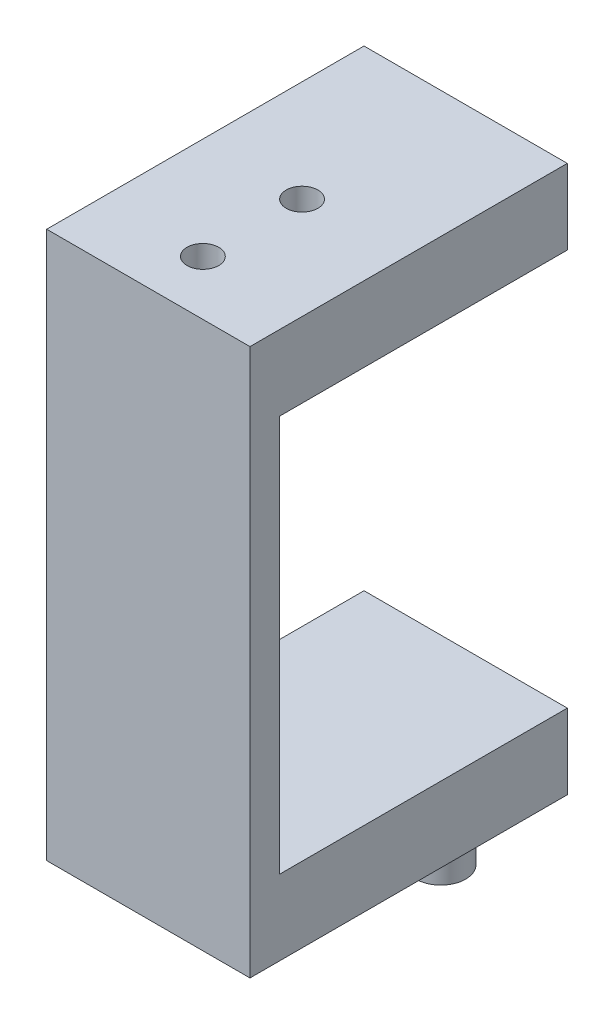
ISO-10303-21;
HEADER;
FILE_DESCRIPTION(('STEP AP214'),'2;1');
FILE_NAME('part.step','',(''),(''),'','','');
FILE_SCHEMA(('AUTOMOTIVE_DESIGN { 1 0 10303 214 1 1 1 1 }'));
ENDSEC;
DATA;
#1=APPLICATION_CONTEXT('core data for automotive mechanical design processes');
#2=APPLICATION_PROTOCOL_DEFINITION('international standard','automotive_design',2000,#1);
#3=PRODUCT_CONTEXT('',#1,'mechanical');
#4=PRODUCT('Part','Part','',(#3));
#5=PRODUCT_RELATED_PRODUCT_CATEGORY('part','',(#4));
#6=PRODUCT_DEFINITION_FORMATION('','',#4);
#7=PRODUCT_DEFINITION_CONTEXT('part definition',#1,'design');
#8=PRODUCT_DEFINITION('design','',#6,#7);
#9=PRODUCT_DEFINITION_SHAPE('','',#8);
#10=(LENGTH_UNIT() NAMED_UNIT(*) SI_UNIT(.MILLI.,.METRE.));
#11=(NAMED_UNIT(*) PLANE_ANGLE_UNIT() SI_UNIT($,.RADIAN.));
#12=(NAMED_UNIT(*) SI_UNIT($,.STERADIAN.) SOLID_ANGLE_UNIT());
#13=UNCERTAINTY_MEASURE_WITH_UNIT(LENGTH_MEASURE(1.E-05),#10,'distance_accuracy_value','');
#14=(GEOMETRIC_REPRESENTATION_CONTEXT(3) GLOBAL_UNCERTAINTY_ASSIGNED_CONTEXT((#13)) GLOBAL_UNIT_ASSIGNED_CONTEXT((#10,
#11,#12)) REPRESENTATION_CONTEXT('',''));
#15=CARTESIAN_POINT('',(0.,0.,0.));
#16=DIRECTION('',(0.,0.,1.));
#17=DIRECTION('',(1.,0.,0.));
#18=AXIS2_PLACEMENT_3D('',#15,#16,#17);
#19=CARTESIAN_POINT('',(10.25,0.,29.));
#20=DIRECTION('',(-1.,0.,0.));
#21=DIRECTION('',(0.,0.,1.));
#22=AXIS2_PLACEMENT_3D('',#19,#20,#21);
#23=PLANE('',#22);
#24=DIRECTION('',(0.,0.,-1.));
#25=VECTOR('',#24,1.);
#26=CARTESIAN_POINT('',(10.25,-27.5708524230847,32.));
#27=LINE('',#26,#25);
#28=CARTESIAN_POINT('',(10.25,-27.5708524230847,32.));
#29=VERTEX_POINT('',#28);
#30=CARTESIAN_POINT('',(10.25,-27.5708524230847,0.));
#31=VERTEX_POINT('',#30);
#32=EDGE_CURVE('E63',#29,#31,#27,.T.);
#33=ORIENTED_EDGE('',*,*,#32,.T.);
#34=DIRECTION('',(0.,1.,0.));
#35=VECTOR('',#34,1.);
#36=CARTESIAN_POINT('',(10.25,0.,0.));
#37=LINE('',#36,#35);
#38=CARTESIAN_POINT('',(10.25,-20.,0.));
#39=VERTEX_POINT('',#38);
#40=EDGE_CURVE('E121',#31,#39,#37,.T.);
#41=ORIENTED_EDGE('',*,*,#40,.T.);
#42=DIRECTION('',(0.,0.,-1.));
#43=VECTOR('',#42,1.);
#44=CARTESIAN_POINT('',(10.25,-20.,29.));
#45=LINE('',#44,#43);
#46=CARTESIAN_POINT('',(10.25,-20.,29.));
#47=VERTEX_POINT('',#46);
#48=EDGE_CURVE('E11',#47,#39,#45,.T.);
#49=ORIENTED_EDGE('',*,*,#48,.F.);
#50=DIRECTION('',(0.,1.,0.));
#51=VECTOR('',#50,1.);
#52=CARTESIAN_POINT('',(10.25,35.1417048461695,29.));
#53=LINE('',#52,#51);
#54=CARTESIAN_POINT('',(10.25,20.,29.));
#55=VERTEX_POINT('',#54);
#56=EDGE_CURVE('E199',#47,#55,#53,.T.);
#57=ORIENTED_EDGE('',*,*,#56,.T.);
#58=DIRECTION('',(0.,0.,-1.));
#59=VECTOR('',#58,1.);
#60=CARTESIAN_POINT('',(10.25,20.,29.));
#61=LINE('',#60,#59);
#62=CARTESIAN_POINT('',(10.25,20.,0.));
#63=VERTEX_POINT('',#62);
#64=EDGE_CURVE('E168',#55,#63,#61,.T.);
#65=ORIENTED_EDGE('',*,*,#64,.T.);
#66=DIRECTION('',(0.,1.,0.));
#67=VECTOR('',#66,1.);
#68=CARTESIAN_POINT('',(10.25,0.,0.));
#69=LINE('',#68,#67);
#70=CARTESIAN_POINT('',(10.25,27.5708524230847,0.));
#71=VERTEX_POINT('',#70);
#72=EDGE_CURVE('E160',#63,#71,#69,.T.);
#73=ORIENTED_EDGE('',*,*,#72,.T.);
#74=DIRECTION('',(0.,0.,-1.));
#75=VECTOR('',#74,1.);
#76=CARTESIAN_POINT('',(10.25,27.5708524230847,32.));
#77=LINE('',#76,#75);
#78=CARTESIAN_POINT('',(10.25,27.5708524230847,32.));
#79=VERTEX_POINT('',#78);
#80=EDGE_CURVE('E71',#79,#71,#77,.T.);
#81=ORIENTED_EDGE('',*,*,#80,.F.);
#82=DIRECTION('',(0.,1.,0.));
#83=VECTOR('',#82,1.);
#84=CARTESIAN_POINT('',(10.25,35.1417048461695,32.));
#85=LINE('',#84,#83);
#86=EDGE_CURVE('E198',#29,#79,#85,.T.);
#87=ORIENTED_EDGE('',*,*,#86,.F.);
#88=EDGE_LOOP('',(#33,#41,#49,#57,#65,#73,#81,#87));
#89=FACE_BOUND('',#88,.T.);
#90=ADVANCED_FACE('F47',(#89),#23,.F.);
#91=CARTESIAN_POINT('',(-10.25,0.,29.));
#92=DIRECTION('',(-1.,0.,0.));
#93=DIRECTION('',(0.,0.,1.));
#94=AXIS2_PLACEMENT_3D('',#91,#92,#93);
#95=PLANE('',#94);
#96=DIRECTION('',(0.,1.,0.));
#97=VECTOR('',#96,1.);
#98=CARTESIAN_POINT('',(-10.25,0.,0.));
#99=LINE('',#98,#97);
#100=CARTESIAN_POINT('',(-10.25,-27.5708524230847,0.));
#101=VERTEX_POINT('',#100);
#102=CARTESIAN_POINT('',(-10.25,-20.,0.));
#103=VERTEX_POINT('',#102);
#104=EDGE_CURVE('E230',#101,#103,#99,.T.);
#105=ORIENTED_EDGE('',*,*,#104,.F.);
#106=DIRECTION('',(0.,0.,-1.));
#107=VECTOR('',#106,1.);
#108=CARTESIAN_POINT('',(-10.25,-27.5708524230847,32.));
#109=LINE('',#108,#107);
#110=CARTESIAN_POINT('',(-10.25,-27.5708524230847,32.));
#111=VERTEX_POINT('',#110);
#112=EDGE_CURVE('E130',#111,#101,#109,.T.);
#113=ORIENTED_EDGE('',*,*,#112,.F.);
#114=DIRECTION('',(0.,-1.,0.));
#115=VECTOR('',#114,1.);
#116=CARTESIAN_POINT('',(-10.25,35.1417048461695,32.));
#117=LINE('',#116,#115);
#118=CARTESIAN_POINT('',(-10.25,27.5708524230847,32.));
#119=VERTEX_POINT('',#118);
#120=EDGE_CURVE('E194',#119,#111,#117,.T.);
#121=ORIENTED_EDGE('',*,*,#120,.F.);
#122=DIRECTION('',(0.,0.,-1.));
#123=VECTOR('',#122,1.);
#124=CARTESIAN_POINT('',(-10.25,27.5708524230847,32.));
#125=LINE('',#124,#123);
#126=CARTESIAN_POINT('',(-10.25,27.5708524230847,0.));
#127=VERTEX_POINT('',#126);
#128=EDGE_CURVE('E134',#119,#127,#125,.T.);
#129=ORIENTED_EDGE('',*,*,#128,.T.);
#130=DIRECTION('',(0.,1.,0.));
#131=VECTOR('',#130,1.);
#132=CARTESIAN_POINT('',(-10.25,0.,0.));
#133=LINE('',#132,#131);
#134=CARTESIAN_POINT('',(-10.25,20.,0.));
#135=VERTEX_POINT('',#134);
#136=EDGE_CURVE('E176',#135,#127,#133,.T.);
#137=ORIENTED_EDGE('',*,*,#136,.F.);
#138=DIRECTION('',(0.,0.,-1.));
#139=VECTOR('',#138,1.);
#140=CARTESIAN_POINT('',(-10.25,20.,29.));
#141=LINE('',#140,#139);
#142=CARTESIAN_POINT('',(-10.25,20.,29.));
#143=VERTEX_POINT('',#142);
#144=EDGE_CURVE('E190',#143,#135,#141,.T.);
#145=ORIENTED_EDGE('',*,*,#144,.F.);
#146=DIRECTION('',(0.,-1.,0.));
#147=VECTOR('',#146,1.);
#148=CARTESIAN_POINT('',(-10.25,35.1417048461695,29.));
#149=LINE('',#148,#147);
#150=CARTESIAN_POINT('',(-10.25,-20.,29.));
#151=VERTEX_POINT('',#150);
#152=EDGE_CURVE('E193',#143,#151,#149,.T.);
#153=ORIENTED_EDGE('',*,*,#152,.T.);
#154=DIRECTION('',(0.,0.,-1.));
#155=VECTOR('',#154,1.);
#156=CARTESIAN_POINT('',(-10.25,-20.,29.));
#157=LINE('',#156,#155);
#158=EDGE_CURVE('E56',#151,#103,#157,.T.);
#159=ORIENTED_EDGE('',*,*,#158,.T.);
#160=EDGE_LOOP('',(#105,#113,#121,#129,#137,#145,#153,#159));
#161=FACE_BOUND('',#160,.T.);
#162=ADVANCED_FACE('F240',(#161),#95,.T.);
#163=CARTESIAN_POINT('',(0.,0.,0.));
#164=DIRECTION('',(0.,0.,1.));
#165=DIRECTION('',(1.,0.,0.));
#166=AXIS2_PLACEMENT_3D('',#163,#164,#165);
#167=PLANE('',#166);
#168=CARTESIAN_POINT('',(-5.,-25.,0.));
#169=DIRECTION('',(0.,0.,1.));
#170=DIRECTION('',(1.,0.,0.));
#171=AXIS2_PLACEMENT_3D('',#168,#169,#170);
#172=CIRCLE('',#171,2.);
#173=CARTESIAN_POINT('',(-7.,-25.,0.));
#174=VERTEX_POINT('',#173);
#175=EDGE_CURVE('E214',#174,#174,#172,.F.);
#176=ORIENTED_EDGE('',*,*,#175,.F.);
#177=EDGE_LOOP('',(#176));
#178=FACE_BOUND('',#177,.T.);
#179=CARTESIAN_POINT('',(5.,-25.,0.));
#180=DIRECTION('',(0.,0.,1.));
#181=DIRECTION('',(1.,0.,0.));
#182=AXIS2_PLACEMENT_3D('',#179,#180,#181);
#183=CIRCLE('',#182,2.);
#184=CARTESIAN_POINT('',(3.,-25.,0.));
#185=VERTEX_POINT('',#184);
#186=EDGE_CURVE('E203',#185,#185,#183,.F.);
#187=ORIENTED_EDGE('',*,*,#186,.F.);
#188=EDGE_LOOP('',(#187));
#189=FACE_BOUND('',#188,.T.);
#190=DIRECTION('',(-1.,0.,0.));
#191=VECTOR('',#190,1.);
#192=CARTESIAN_POINT('',(0.,-27.5708524230847,0.));
#193=LINE('',#192,#191);
#194=CARTESIAN_POINT('',(0.,-27.5708524230847,0.));
#195=VERTEX_POINT('',#194);
#196=EDGE_CURVE('E115',#31,#195,#193,.T.);
#197=ORIENTED_EDGE('',*,*,#196,.T.);
#198=EDGE_CURVE('E118',#195,#101,#193,.T.);
#199=ORIENTED_EDGE('',*,*,#198,.T.);
#200=ORIENTED_EDGE('',*,*,#104,.T.);
#201=DIRECTION('',(1.,0.,0.));
#202=VECTOR('',#201,1.);
#203=CARTESIAN_POINT('',(0.,-20.,0.));
#204=LINE('',#203,#202);
#205=EDGE_CURVE('E227',#103,#39,#204,.T.);
#206=ORIENTED_EDGE('',*,*,#205,.T.);
#207=ORIENTED_EDGE('',*,*,#40,.F.);
#208=EDGE_LOOP('',(#197,#199,#200,#206,#207));
#209=FACE_BOUND('',#208,.T.);
#210=ADVANCED_FACE('F117',(#178,#189,#209),#167,.F.);
#211=CARTESIAN_POINT('',(0.,0.,32.));
#212=DIRECTION('',(0.,0.,1.));
#213=DIRECTION('',(1.,0.,0.));
#214=AXIS2_PLACEMENT_3D('',#211,#212,#213);
#215=PLANE('',#214);
#216=ORIENTED_EDGE('',*,*,#120,.T.);
#217=DIRECTION('',(-1.,0.,0.));
#218=VECTOR('',#217,1.);
#219=CARTESIAN_POINT('',(0.,-27.5708524230847,32.));
#220=LINE('',#219,#218);
#221=EDGE_CURVE('E124',#29,#111,#220,.T.);
#222=ORIENTED_EDGE('',*,*,#221,.F.);
#223=ORIENTED_EDGE('',*,*,#86,.T.);
#224=DIRECTION('',(-1.,0.,0.));
#225=VECTOR('',#224,1.);
#226=CARTESIAN_POINT('',(0.,27.5708524230847,32.));
#227=LINE('',#226,#225);
#228=EDGE_CURVE('E144',#79,#119,#227,.T.);
#229=ORIENTED_EDGE('',*,*,#228,.T.);
#230=EDGE_LOOP('',(#216,#222,#223,#229));
#231=FACE_BOUND('',#230,.T.);
#232=ADVANCED_FACE('F249',(#231),#215,.T.);
#233=CARTESIAN_POINT('',(0.,0.,29.));
#234=DIRECTION('',(0.,0.,1.));
#235=DIRECTION('',(1.,0.,0.));
#236=AXIS2_PLACEMENT_3D('',#233,#234,#235);
#237=PLANE('',#236);
#238=DIRECTION('',(1.,0.,0.));
#239=VECTOR('',#238,1.);
#240=CARTESIAN_POINT('',(0.,20.,29.));
#241=LINE('',#240,#239);
#242=EDGE_CURVE('E164',#143,#55,#241,.T.);
#243=ORIENTED_EDGE('',*,*,#242,.T.);
#244=ORIENTED_EDGE('',*,*,#56,.F.);
#245=DIRECTION('',(1.,0.,0.));
#246=VECTOR('',#245,1.);
#247=CARTESIAN_POINT('',(0.,-20.,29.));
#248=LINE('',#247,#246);
#249=EDGE_CURVE('E213',#151,#47,#248,.T.);
#250=ORIENTED_EDGE('',*,*,#249,.F.);
#251=ORIENTED_EDGE('',*,*,#152,.F.);
#252=EDGE_LOOP('',(#243,#244,#250,#251));
#253=FACE_BOUND('',#252,.T.);
#254=ADVANCED_FACE('F260',(#253),#237,.F.);
#255=CARTESIAN_POINT('',(0.,-20.,29.));
#256=DIRECTION('',(0.,1.,0.));
#257=DIRECTION('',(0.,0.,1.));
#258=AXIS2_PLACEMENT_3D('',#255,#256,#257);
#259=PLANE('',#258);
#260=ORIENTED_EDGE('',*,*,#205,.F.);
#261=ORIENTED_EDGE('',*,*,#158,.F.);
#262=ORIENTED_EDGE('',*,*,#249,.T.);
#263=ORIENTED_EDGE('',*,*,#48,.T.);
#264=EDGE_LOOP('',(#260,#261,#262,#263));
#265=FACE_BOUND('',#264,.T.);
#266=ADVANCED_FACE('F244',(#265),#259,.T.);
#267=CARTESIAN_POINT('',(5.,-25.,29.));
#268=DIRECTION('',(0.,0.,-1.));
#269=DIRECTION('',(-1.,0.,0.));
#270=AXIS2_PLACEMENT_3D('',#267,#268,#269);
#271=CYLINDRICAL_SURFACE('',#270,2.);
#272=CARTESIAN_POINT('',(5.,-25.,29.));
#273=DIRECTION('',(0.,0.,1.));
#274=DIRECTION('',(1.,0.,0.));
#275=AXIS2_PLACEMENT_3D('',#272,#273,#274);
#276=CIRCLE('',#275,2.);
#277=CARTESIAN_POINT('',(3.,-25.,29.));
#278=VERTEX_POINT('',#277);
#279=EDGE_CURVE('E209',#278,#278,#276,.F.);
#280=CARTESIAN_POINT('',(3.,-25.,29.));
#281=CARTESIAN_POINT('',(3.,-25.,28.6979166666667));
#282=CARTESIAN_POINT('',(3.,-25.,28.3958333333333));
#283=CARTESIAN_POINT('',(3.,-25.,27.7916666666667));
#284=CARTESIAN_POINT('',(3.,-25.,27.4895833333333));
#285=CARTESIAN_POINT('',(3.,-25.,26.8854166666667));
#286=CARTESIAN_POINT('',(3.,-25.,26.5833333333333));
#287=CARTESIAN_POINT('',(3.,-25.,25.9791666666667));
#288=CARTESIAN_POINT('',(3.,-25.,25.6770833333333));
#289=CARTESIAN_POINT('',(3.,-25.,25.0729166666667));
#290=CARTESIAN_POINT('',(3.,-25.,24.7708333333333));
#291=CARTESIAN_POINT('',(3.,-25.,24.1666666666667));
#292=CARTESIAN_POINT('',(3.,-25.,23.8645833333333));
#293=CARTESIAN_POINT('',(3.,-25.,23.2604166666667));
#294=CARTESIAN_POINT('',(3.,-25.,22.9583333333333));
#295=CARTESIAN_POINT('',(3.,-25.,22.3541666666667));
#296=CARTESIAN_POINT('',(3.,-25.,22.0520833333333));
#297=CARTESIAN_POINT('',(3.,-25.,21.4479166666667));
#298=CARTESIAN_POINT('',(3.,-25.,21.1458333333333));
#299=CARTESIAN_POINT('',(3.,-25.,20.5416666666667));
#300=CARTESIAN_POINT('',(3.,-25.,20.2395833333333));
#301=CARTESIAN_POINT('',(3.,-25.,19.6354166666667));
#302=CARTESIAN_POINT('',(3.,-25.,19.3333333333333));
#303=CARTESIAN_POINT('',(3.,-25.,18.7291666666667));
#304=CARTESIAN_POINT('',(3.,-25.,18.4270833333333));
#305=CARTESIAN_POINT('',(3.,-25.,17.8229166666667));
#306=CARTESIAN_POINT('',(3.,-25.,17.5208333333333));
#307=CARTESIAN_POINT('',(3.,-25.,16.9166666666667));
#308=CARTESIAN_POINT('',(3.,-25.,16.6145833333333));
#309=CARTESIAN_POINT('',(3.,-25.,16.0104166666667));
#310=CARTESIAN_POINT('',(3.,-25.,15.7083333333333));
#311=CARTESIAN_POINT('',(3.,-25.,15.1041666666667));
#312=CARTESIAN_POINT('',(3.,-25.,14.8020833333333));
#313=CARTESIAN_POINT('',(3.,-25.,14.1979166666667));
#314=CARTESIAN_POINT('',(3.,-25.,13.8958333333333));
#315=CARTESIAN_POINT('',(3.,-25.,13.2916666666667));
#316=CARTESIAN_POINT('',(3.,-25.,12.9895833333333));
#317=CARTESIAN_POINT('',(3.,-25.,12.3854166666667));
#318=CARTESIAN_POINT('',(3.,-25.,12.0833333333333));
#319=CARTESIAN_POINT('',(3.,-25.,11.4791666666667));
#320=CARTESIAN_POINT('',(3.,-25.,11.1770833333333));
#321=CARTESIAN_POINT('',(3.,-25.,10.5729166666667));
#322=CARTESIAN_POINT('',(3.,-25.,10.2708333333333));
#323=CARTESIAN_POINT('',(3.,-25.,9.66666666666667));
#324=CARTESIAN_POINT('',(3.,-25.,9.36458333333333));
#325=CARTESIAN_POINT('',(3.,-25.,8.76041666666667));
#326=CARTESIAN_POINT('',(3.,-25.,8.45833333333333));
#327=CARTESIAN_POINT('',(3.,-25.,7.85416666666667));
#328=CARTESIAN_POINT('',(3.,-25.,7.55208333333333));
#329=CARTESIAN_POINT('',(3.,-25.,6.94791666666667));
#330=CARTESIAN_POINT('',(3.,-25.,6.64583333333333));
#331=CARTESIAN_POINT('',(3.,-25.,6.04166666666667));
#332=CARTESIAN_POINT('',(3.,-25.,5.73958333333333));
#333=CARTESIAN_POINT('',(3.,-25.,5.13541666666667));
#334=CARTESIAN_POINT('',(3.,-25.,4.83333333333333));
#335=CARTESIAN_POINT('',(3.,-25.,4.22916666666667));
#336=CARTESIAN_POINT('',(3.,-25.,3.92708333333333));
#337=CARTESIAN_POINT('',(3.,-25.,3.32291666666667));
#338=CARTESIAN_POINT('',(3.,-25.,3.02083333333333));
#339=CARTESIAN_POINT('',(3.,-25.,2.41666666666667));
#340=CARTESIAN_POINT('',(3.,-25.,2.11458333333333));
#341=CARTESIAN_POINT('',(3.,-25.,1.51041666666667));
#342=CARTESIAN_POINT('',(3.,-25.,1.20833333333333));
#343=CARTESIAN_POINT('',(3.,-25.,0.604166666666667));
#344=CARTESIAN_POINT('',(3.,-25.,0.302083333333333));
#345=CARTESIAN_POINT('',(3.,-25.,0.));
#346=B_SPLINE_CURVE_WITH_KNOTS('',3,(#280,#281,#282,#283,#284,#285,#286,#287,#288,#289,#290,
#291,#292,#293,#294,#295,#296,#297,#298,#299,#300,#301,#302,#303,#304,#305,#306,#307,#308,#309,
#310,#311,#312,#313,#314,#315,#316,#317,#318,#319,#320,#321,#322,#323,#324,#325,#326,#327,#328,
#329,#330,#331,#332,#333,#334,#335,#336,#337,#338,#339,#340,#341,#342,#343,#344,#345),
.UNSPECIFIED.,.F.,.F.,(4,2,2,2,2,2,2,2,2,2,2,2,2,2,2,2,2,2,2,2,2,2,2,2,2,2,2,2,2,2,2,2,4),(0.,
0.906249999999997,1.8125,2.71875,3.625,4.53125,5.4375,6.34375,7.25,8.15625,9.0625,9.96875,
10.875,11.78125,12.6875,13.59375,14.5,15.40625,16.3125,17.21875,18.125,19.03125,19.9375,
20.84375,21.75,22.65625,23.5625,24.46875,25.375,26.28125,27.1875,28.09375,29.),.UNSPECIFIED.);
#347=EDGE_CURVE('BSEAM49',#278,#185,#346,.T.);
#348=ORIENTED_EDGE('',*,*,#279,.F.);
#349=ORIENTED_EDGE('',*,*,#186,.T.);
#350=ORIENTED_EDGE('',*,*,#347,.T.);
#351=ORIENTED_EDGE('',*,*,#347,.F.);
#352=EDGE_LOOP('',(#348,#350,#349,#351));
#353=FACE_BOUND('',#352,.T.);
#354=ADVANCED_FACE('F49',(#353),#271,.F.);
#355=CARTESIAN_POINT('',(-5.,-25.,29.));
#356=DIRECTION('',(0.,0.,-1.));
#357=DIRECTION('',(-1.,0.,0.));
#358=AXIS2_PLACEMENT_3D('',#355,#356,#357);
#359=CYLINDRICAL_SURFACE('',#358,2.);
#360=CARTESIAN_POINT('',(-5.,-25.,29.));
#361=DIRECTION('',(0.,0.,1.));
#362=DIRECTION('',(1.,0.,0.));
#363=AXIS2_PLACEMENT_3D('',#360,#361,#362);
#364=CIRCLE('',#363,2.);
#365=CARTESIAN_POINT('',(-7.,-25.,29.));
#366=VERTEX_POINT('',#365);
#367=EDGE_CURVE('E218',#366,#366,#364,.F.);
#368=CARTESIAN_POINT('',(-7.,-25.,29.));
#369=CARTESIAN_POINT('',(-7.,-25.,28.6979166666667));
#370=CARTESIAN_POINT('',(-7.,-25.,28.3958333333333));
#371=CARTESIAN_POINT('',(-7.,-25.,27.7916666666667));
#372=CARTESIAN_POINT('',(-7.,-25.,27.4895833333333));
#373=CARTESIAN_POINT('',(-7.,-25.,26.8854166666667));
#374=CARTESIAN_POINT('',(-7.,-25.,26.5833333333333));
#375=CARTESIAN_POINT('',(-7.,-25.,25.9791666666667));
#376=CARTESIAN_POINT('',(-7.,-25.,25.6770833333333));
#377=CARTESIAN_POINT('',(-7.,-25.,25.0729166666667));
#378=CARTESIAN_POINT('',(-7.,-25.,24.7708333333333));
#379=CARTESIAN_POINT('',(-7.,-25.,24.1666666666667));
#380=CARTESIAN_POINT('',(-7.,-25.,23.8645833333333));
#381=CARTESIAN_POINT('',(-7.,-25.,23.2604166666667));
#382=CARTESIAN_POINT('',(-7.,-25.,22.9583333333333));
#383=CARTESIAN_POINT('',(-7.,-25.,22.3541666666667));
#384=CARTESIAN_POINT('',(-7.,-25.,22.0520833333333));
#385=CARTESIAN_POINT('',(-7.,-25.,21.4479166666667));
#386=CARTESIAN_POINT('',(-7.,-25.,21.1458333333333));
#387=CARTESIAN_POINT('',(-7.,-25.,20.5416666666667));
#388=CARTESIAN_POINT('',(-7.,-25.,20.2395833333333));
#389=CARTESIAN_POINT('',(-7.,-25.,19.6354166666667));
#390=CARTESIAN_POINT('',(-7.,-25.,19.3333333333333));
#391=CARTESIAN_POINT('',(-7.,-25.,18.7291666666667));
#392=CARTESIAN_POINT('',(-7.,-25.,18.4270833333333));
#393=CARTESIAN_POINT('',(-7.,-25.,17.8229166666667));
#394=CARTESIAN_POINT('',(-7.,-25.,17.5208333333333));
#395=CARTESIAN_POINT('',(-7.,-25.,16.9166666666667));
#396=CARTESIAN_POINT('',(-7.,-25.,16.6145833333333));
#397=CARTESIAN_POINT('',(-7.,-25.,16.0104166666667));
#398=CARTESIAN_POINT('',(-7.,-25.,15.7083333333333));
#399=CARTESIAN_POINT('',(-7.,-25.,15.1041666666667));
#400=CARTESIAN_POINT('',(-7.,-25.,14.8020833333333));
#401=CARTESIAN_POINT('',(-7.,-25.,14.1979166666667));
#402=CARTESIAN_POINT('',(-7.,-25.,13.8958333333333));
#403=CARTESIAN_POINT('',(-7.,-25.,13.2916666666667));
#404=CARTESIAN_POINT('',(-7.,-25.,12.9895833333333));
#405=CARTESIAN_POINT('',(-7.,-25.,12.3854166666667));
#406=CARTESIAN_POINT('',(-7.,-25.,12.0833333333333));
#407=CARTESIAN_POINT('',(-7.,-25.,11.4791666666667));
#408=CARTESIAN_POINT('',(-7.,-25.,11.1770833333333));
#409=CARTESIAN_POINT('',(-7.,-25.,10.5729166666667));
#410=CARTESIAN_POINT('',(-7.,-25.,10.2708333333333));
#411=CARTESIAN_POINT('',(-7.,-25.,9.66666666666667));
#412=CARTESIAN_POINT('',(-7.,-25.,9.36458333333333));
#413=CARTESIAN_POINT('',(-7.,-25.,8.76041666666667));
#414=CARTESIAN_POINT('',(-7.,-25.,8.45833333333333));
#415=CARTESIAN_POINT('',(-7.,-25.,7.85416666666667));
#416=CARTESIAN_POINT('',(-7.,-25.,7.55208333333333));
#417=CARTESIAN_POINT('',(-7.,-25.,6.94791666666667));
#418=CARTESIAN_POINT('',(-7.,-25.,6.64583333333333));
#419=CARTESIAN_POINT('',(-7.,-25.,6.04166666666667));
#420=CARTESIAN_POINT('',(-7.,-25.,5.73958333333333));
#421=CARTESIAN_POINT('',(-7.,-25.,5.13541666666667));
#422=CARTESIAN_POINT('',(-7.,-25.,4.83333333333333));
#423=CARTESIAN_POINT('',(-7.,-25.,4.22916666666667));
#424=CARTESIAN_POINT('',(-7.,-25.,3.92708333333333));
#425=CARTESIAN_POINT('',(-7.,-25.,3.32291666666667));
#426=CARTESIAN_POINT('',(-7.,-25.,3.02083333333333));
#427=CARTESIAN_POINT('',(-7.,-25.,2.41666666666667));
#428=CARTESIAN_POINT('',(-7.,-25.,2.11458333333333));
#429=CARTESIAN_POINT('',(-7.,-25.,1.51041666666667));
#430=CARTESIAN_POINT('',(-7.,-25.,1.20833333333333));
#431=CARTESIAN_POINT('',(-7.,-25.,0.604166666666667));
#432=CARTESIAN_POINT('',(-7.,-25.,0.302083333333333));
#433=CARTESIAN_POINT('',(-7.,-25.,0.));
#434=B_SPLINE_CURVE_WITH_KNOTS('',3,(#368,#369,#370,#371,#372,#373,#374,#375,#376,#377,#378,
#379,#380,#381,#382,#383,#384,#385,#386,#387,#388,#389,#390,#391,#392,#393,#394,#395,#396,#397,
#398,#399,#400,#401,#402,#403,#404,#405,#406,#407,#408,#409,#410,#411,#412,#413,#414,#415,#416,
#417,#418,#419,#420,#421,#422,#423,#424,#425,#426,#427,#428,#429,#430,#431,#432,#433),
.UNSPECIFIED.,.F.,.F.,(4,2,2,2,2,2,2,2,2,2,2,2,2,2,2,2,2,2,2,2,2,2,2,2,2,2,2,2,2,2,2,2,4),(0.,
0.906249999999997,1.8125,2.71875,3.625,4.53125,5.4375,6.34375,7.25,8.15625,9.0625,9.96875,
10.875,11.78125,12.6875,13.59375,14.5,15.40625,16.3125,17.21875,18.125,19.03125,19.9375,
20.84375,21.75,22.65625,23.5625,24.46875,25.375,26.28125,27.1875,28.09375,29.),.UNSPECIFIED.);
#435=EDGE_CURVE('BSEAM286',#366,#174,#434,.T.);
#436=ORIENTED_EDGE('',*,*,#367,.F.);
#437=ORIENTED_EDGE('',*,*,#175,.T.);
#438=ORIENTED_EDGE('',*,*,#435,.T.);
#439=ORIENTED_EDGE('',*,*,#435,.F.);
#440=EDGE_LOOP('',(#436,#438,#437,#439));
#441=FACE_BOUND('',#440,.T.);
#442=ADVANCED_FACE('F286',(#441),#359,.F.);
#443=ORIENTED_EDGE('',*,*,#367,.T.);
#444=EDGE_LOOP('',(#443));
#445=FACE_BOUND('',#444,.T.);
#446=ADVANCED_FACE('F279',(#445),#237,.F.);
#447=ORIENTED_EDGE('',*,*,#279,.T.);
#448=EDGE_LOOP('',(#447));
#449=FACE_BOUND('',#448,.T.);
#450=ADVANCED_FACE('F276',(#449),#237,.F.);
#451=CARTESIAN_POINT('',(0.,20.,29.));
#452=DIRECTION('',(0.,1.,0.));
#453=DIRECTION('',(0.,0.,1.));
#454=AXIS2_PLACEMENT_3D('',#451,#452,#453);
#455=PLANE('',#454);
#456=CARTESIAN_POINT('',(0.,20.,16.5));
#457=DIRECTION('',(0.,1.,0.));
#458=DIRECTION('',(0.,0.,1.));
#459=AXIS2_PLACEMENT_3D('',#456,#457,#458);
#460=CIRCLE('',#459,1.6);
#461=CARTESIAN_POINT('',(0.,20.,18.1));
#462=VERTEX_POINT('',#461);
#463=EDGE_CURVE('E475',#462,#462,#460,.F.);
#464=ORIENTED_EDGE('',*,*,#463,.F.);
#465=EDGE_LOOP('',(#464));
#466=FACE_BOUND('',#465,.T.);
#467=CARTESIAN_POINT('',(0.,20.,26.5));
#468=DIRECTION('',(0.,1.,0.));
#469=DIRECTION('',(0.,0.,1.));
#470=AXIS2_PLACEMENT_3D('',#467,#468,#469);
#471=CIRCLE('',#470,1.6);
#472=CARTESIAN_POINT('',(0.,20.,28.1));
#473=VERTEX_POINT('',#472);
#474=EDGE_CURVE('E480',#473,#473,#471,.F.);
#475=ORIENTED_EDGE('',*,*,#474,.F.);
#476=EDGE_LOOP('',(#475));
#477=FACE_BOUND('',#476,.T.);
#478=DIRECTION('',(1.,0.,0.));
#479=VECTOR('',#478,1.);
#480=CARTESIAN_POINT('',(0.,20.,0.));
#481=LINE('',#480,#479);
#482=EDGE_CURVE('E180',#135,#63,#481,.T.);
#483=ORIENTED_EDGE('',*,*,#482,.T.);
#484=ORIENTED_EDGE('',*,*,#64,.F.);
#485=ORIENTED_EDGE('',*,*,#242,.F.);
#486=ORIENTED_EDGE('',*,*,#144,.T.);
#487=EDGE_LOOP('',(#483,#484,#485,#486));
#488=FACE_BOUND('',#487,.T.);
#489=ADVANCED_FACE('F257',(#466,#477,#488),#455,.F.);
#490=CARTESIAN_POINT('',(-5.,25.,29.));
#491=DIRECTION('',(0.,0.,-1.));
#492=DIRECTION('',(-1.,0.,0.));
#493=AXIS2_PLACEMENT_3D('',#490,#491,#492);
#494=CYLINDRICAL_SURFACE('',#493,2.);
#495=CARTESIAN_POINT('',(-5.,25.,29.));
#496=DIRECTION('',(0.,0.,1.));
#497=DIRECTION('',(1.,0.,0.));
#498=AXIS2_PLACEMENT_3D('',#495,#496,#497);
#499=CIRCLE('',#498,2.);
#500=CARTESIAN_POINT('',(-7.,25.,29.));
#501=VERTEX_POINT('',#500);
#502=EDGE_CURVE('E159',#501,#501,#499,.T.);
#503=CARTESIAN_POINT('',(-5.,25.,0.));
#504=DIRECTION('',(0.,0.,1.));
#505=DIRECTION('',(1.,0.,0.));
#506=AXIS2_PLACEMENT_3D('',#503,#504,#505);
#507=CIRCLE('',#506,2.);
#508=CARTESIAN_POINT('',(-7.,25.,0.));
#509=VERTEX_POINT('',#508);
#510=EDGE_CURVE('E172',#509,#509,#507,.T.);
#511=CARTESIAN_POINT('',(-7.,25.,29.));
#512=CARTESIAN_POINT('',(-7.,25.,28.6979166666667));
#513=CARTESIAN_POINT('',(-7.,25.,28.3958333333333));
#514=CARTESIAN_POINT('',(-7.,25.,27.7916666666667));
#515=CARTESIAN_POINT('',(-7.,25.,27.4895833333333));
#516=CARTESIAN_POINT('',(-7.,25.,26.8854166666667));
#517=CARTESIAN_POINT('',(-7.,25.,26.5833333333333));
#518=CARTESIAN_POINT('',(-7.,25.,25.9791666666667));
#519=CARTESIAN_POINT('',(-7.,25.,25.6770833333333));
#520=CARTESIAN_POINT('',(-7.,25.,25.0729166666667));
#521=CARTESIAN_POINT('',(-7.,25.,24.7708333333333));
#522=CARTESIAN_POINT('',(-7.,25.,24.1666666666667));
#523=CARTESIAN_POINT('',(-7.,25.,23.8645833333333));
#524=CARTESIAN_POINT('',(-7.,25.,23.2604166666667));
#525=CARTESIAN_POINT('',(-7.,25.,22.9583333333333));
#526=CARTESIAN_POINT('',(-7.,25.,22.3541666666667));
#527=CARTESIAN_POINT('',(-7.,25.,22.0520833333333));
#528=CARTESIAN_POINT('',(-7.,25.,21.4479166666667));
#529=CARTESIAN_POINT('',(-7.,25.,21.1458333333333));
#530=CARTESIAN_POINT('',(-7.,25.,20.5416666666667));
#531=CARTESIAN_POINT('',(-7.,25.,20.2395833333333));
#532=CARTESIAN_POINT('',(-7.,25.,19.6354166666667));
#533=CARTESIAN_POINT('',(-7.,25.,19.3333333333333));
#534=CARTESIAN_POINT('',(-7.,25.,18.7291666666667));
#535=CARTESIAN_POINT('',(-7.,25.,18.4270833333333));
#536=CARTESIAN_POINT('',(-7.,25.,17.8229166666667));
#537=CARTESIAN_POINT('',(-7.,25.,17.5208333333333));
#538=CARTESIAN_POINT('',(-7.,25.,16.9166666666667));
#539=CARTESIAN_POINT('',(-7.,25.,16.6145833333333));
#540=CARTESIAN_POINT('',(-7.,25.,16.0104166666667));
#541=CARTESIAN_POINT('',(-7.,25.,15.7083333333333));
#542=CARTESIAN_POINT('',(-7.,25.,15.1041666666667));
#543=CARTESIAN_POINT('',(-7.,25.,14.8020833333333));
#544=CARTESIAN_POINT('',(-7.,25.,14.1979166666667));
#545=CARTESIAN_POINT('',(-7.,25.,13.8958333333333));
#546=CARTESIAN_POINT('',(-7.,25.,13.2916666666667));
#547=CARTESIAN_POINT('',(-7.,25.,12.9895833333333));
#548=CARTESIAN_POINT('',(-7.,25.,12.3854166666667));
#549=CARTESIAN_POINT('',(-7.,25.,12.0833333333333));
#550=CARTESIAN_POINT('',(-7.,25.,11.4791666666667));
#551=CARTESIAN_POINT('',(-7.,25.,11.1770833333333));
#552=CARTESIAN_POINT('',(-7.,25.,10.5729166666667));
#553=CARTESIAN_POINT('',(-7.,25.,10.2708333333333));
#554=CARTESIAN_POINT('',(-7.,25.,9.66666666666667));
#555=CARTESIAN_POINT('',(-7.,25.,9.36458333333333));
#556=CARTESIAN_POINT('',(-7.,25.,8.76041666666667));
#557=CARTESIAN_POINT('',(-7.,25.,8.45833333333333));
#558=CARTESIAN_POINT('',(-7.,25.,7.85416666666667));
#559=CARTESIAN_POINT('',(-7.,25.,7.55208333333333));
#560=CARTESIAN_POINT('',(-7.,25.,6.94791666666667));
#561=CARTESIAN_POINT('',(-7.,25.,6.64583333333333));
#562=CARTESIAN_POINT('',(-7.,25.,6.04166666666667));
#563=CARTESIAN_POINT('',(-7.,25.,5.73958333333333));
#564=CARTESIAN_POINT('',(-7.,25.,5.13541666666667));
#565=CARTESIAN_POINT('',(-7.,25.,4.83333333333333));
#566=CARTESIAN_POINT('',(-7.,25.,4.22916666666667));
#567=CARTESIAN_POINT('',(-7.,25.,3.92708333333333));
#568=CARTESIAN_POINT('',(-7.,25.,3.32291666666667));
#569=CARTESIAN_POINT('',(-7.,25.,3.02083333333333));
#570=CARTESIAN_POINT('',(-7.,25.,2.41666666666667));
#571=CARTESIAN_POINT('',(-7.,25.,2.11458333333333));
#572=CARTESIAN_POINT('',(-7.,25.,1.51041666666667));
#573=CARTESIAN_POINT('',(-7.,25.,1.20833333333333));
#574=CARTESIAN_POINT('',(-7.,25.,0.604166666666667));
#575=CARTESIAN_POINT('',(-7.,25.,0.302083333333333));
#576=CARTESIAN_POINT('',(-7.,25.,0.));
#577=B_SPLINE_CURVE_WITH_KNOTS('',3,(#511,#512,#513,#514,#515,#516,#517,#518,#519,#520,#521,
#522,#523,#524,#525,#526,#527,#528,#529,#530,#531,#532,#533,#534,#535,#536,#537,#538,#539,#540,
#541,#542,#543,#544,#545,#546,#547,#548,#549,#550,#551,#552,#553,#554,#555,#556,#557,#558,#559,
#560,#561,#562,#563,#564,#565,#566,#567,#568,#569,#570,#571,#572,#573,#574,#575,#576),
.UNSPECIFIED.,.F.,.F.,(4,2,2,2,2,2,2,2,2,2,2,2,2,2,2,2,2,2,2,2,2,2,2,2,2,2,2,2,2,2,2,2,4),(0.,
0.906249999999997,1.8125,2.71875,3.625,4.53125,5.4375,6.34375,7.25,8.15625,9.0625,9.96875,
10.875,11.78125,12.6875,13.59375,14.5,15.40625,16.3125,17.21875,18.125,19.03125,19.9375,
20.84375,21.75,22.65625,23.5625,24.46875,25.375,26.28125,27.1875,28.09375,29.),.UNSPECIFIED.);
#578=EDGE_CURVE('BSEAM310',#501,#509,#577,.T.);
#579=ORIENTED_EDGE('',*,*,#502,.T.);
#580=ORIENTED_EDGE('',*,*,#510,.F.);
#581=ORIENTED_EDGE('',*,*,#578,.T.);
#582=ORIENTED_EDGE('',*,*,#578,.F.);
#583=EDGE_LOOP('',(#579,#581,#580,#582));
#584=FACE_BOUND('',#583,.T.);
#585=ADVANCED_FACE('F310',(#584),#494,.F.);
#586=CARTESIAN_POINT('',(5.,25.,29.));
#587=DIRECTION('',(0.,0.,-1.));
#588=DIRECTION('',(-1.,0.,0.));
#589=AXIS2_PLACEMENT_3D('',#586,#587,#588);
#590=CYLINDRICAL_SURFACE('',#589,2.);
#591=CARTESIAN_POINT('',(5.,25.,29.));
#592=DIRECTION('',(0.,0.,1.));
#593=DIRECTION('',(1.,0.,0.));
#594=AXIS2_PLACEMENT_3D('',#591,#592,#593);
#595=CIRCLE('',#594,2.);
#596=CARTESIAN_POINT('',(3.,25.,29.));
#597=VERTEX_POINT('',#596);
#598=EDGE_CURVE('E155',#597,#597,#595,.T.);
#599=CARTESIAN_POINT('',(5.,25.,0.));
#600=DIRECTION('',(0.,0.,1.));
#601=DIRECTION('',(1.,0.,0.));
#602=AXIS2_PLACEMENT_3D('',#599,#600,#601);
#603=CIRCLE('',#602,2.);
#604=CARTESIAN_POINT('',(3.,25.,0.));
#605=VERTEX_POINT('',#604);
#606=EDGE_CURVE('E141',#605,#605,#603,.T.);
#607=CARTESIAN_POINT('',(3.,25.,29.));
#608=CARTESIAN_POINT('',(3.,25.,28.6979166666667));
#609=CARTESIAN_POINT('',(3.,25.,28.3958333333333));
#610=CARTESIAN_POINT('',(3.,25.,27.7916666666667));
#611=CARTESIAN_POINT('',(3.,25.,27.4895833333333));
#612=CARTESIAN_POINT('',(3.,25.,26.8854166666667));
#613=CARTESIAN_POINT('',(3.,25.,26.5833333333333));
#614=CARTESIAN_POINT('',(3.,25.,25.9791666666667));
#615=CARTESIAN_POINT('',(3.,25.,25.6770833333333));
#616=CARTESIAN_POINT('',(3.,25.,25.0729166666667));
#617=CARTESIAN_POINT('',(3.,25.,24.7708333333333));
#618=CARTESIAN_POINT('',(3.,25.,24.1666666666667));
#619=CARTESIAN_POINT('',(3.,25.,23.8645833333333));
#620=CARTESIAN_POINT('',(3.,25.,23.2604166666667));
#621=CARTESIAN_POINT('',(3.,25.,22.9583333333333));
#622=CARTESIAN_POINT('',(3.,25.,22.3541666666667));
#623=CARTESIAN_POINT('',(3.,25.,22.0520833333333));
#624=CARTESIAN_POINT('',(3.,25.,21.4479166666667));
#625=CARTESIAN_POINT('',(3.,25.,21.1458333333333));
#626=CARTESIAN_POINT('',(3.,25.,20.5416666666667));
#627=CARTESIAN_POINT('',(3.,25.,20.2395833333333));
#628=CARTESIAN_POINT('',(3.,25.,19.6354166666667));
#629=CARTESIAN_POINT('',(3.,25.,19.3333333333333));
#630=CARTESIAN_POINT('',(3.,25.,18.7291666666667));
#631=CARTESIAN_POINT('',(3.,25.,18.4270833333333));
#632=CARTESIAN_POINT('',(3.,25.,17.8229166666667));
#633=CARTESIAN_POINT('',(3.,25.,17.5208333333333));
#634=CARTESIAN_POINT('',(3.,25.,16.9166666666667));
#635=CARTESIAN_POINT('',(3.,25.,16.6145833333333));
#636=CARTESIAN_POINT('',(3.,25.,16.0104166666667));
#637=CARTESIAN_POINT('',(3.,25.,15.7083333333333));
#638=CARTESIAN_POINT('',(3.,25.,15.1041666666667));
#639=CARTESIAN_POINT('',(3.,25.,14.8020833333333));
#640=CARTESIAN_POINT('',(3.,25.,14.1979166666667));
#641=CARTESIAN_POINT('',(3.,25.,13.8958333333333));
#642=CARTESIAN_POINT('',(3.,25.,13.2916666666667));
#643=CARTESIAN_POINT('',(3.,25.,12.9895833333333));
#644=CARTESIAN_POINT('',(3.,25.,12.3854166666667));
#645=CARTESIAN_POINT('',(3.,25.,12.0833333333333));
#646=CARTESIAN_POINT('',(3.,25.,11.4791666666667));
#647=CARTESIAN_POINT('',(3.,25.,11.1770833333333));
#648=CARTESIAN_POINT('',(3.,25.,10.5729166666667));
#649=CARTESIAN_POINT('',(3.,25.,10.2708333333333));
#650=CARTESIAN_POINT('',(3.,25.,9.66666666666667));
#651=CARTESIAN_POINT('',(3.,25.,9.36458333333333));
#652=CARTESIAN_POINT('',(3.,25.,8.76041666666667));
#653=CARTESIAN_POINT('',(3.,25.,8.45833333333333));
#654=CARTESIAN_POINT('',(3.,25.,7.85416666666667));
#655=CARTESIAN_POINT('',(3.,25.,7.55208333333333));
#656=CARTESIAN_POINT('',(3.,25.,6.94791666666667));
#657=CARTESIAN_POINT('',(3.,25.,6.64583333333333));
#658=CARTESIAN_POINT('',(3.,25.,6.04166666666667));
#659=CARTESIAN_POINT('',(3.,25.,5.73958333333333));
#660=CARTESIAN_POINT('',(3.,25.,5.13541666666667));
#661=CARTESIAN_POINT('',(3.,25.,4.83333333333333));
#662=CARTESIAN_POINT('',(3.,25.,4.22916666666667));
#663=CARTESIAN_POINT('',(3.,25.,3.92708333333333));
#664=CARTESIAN_POINT('',(3.,25.,3.32291666666667));
#665=CARTESIAN_POINT('',(3.,25.,3.02083333333333));
#666=CARTESIAN_POINT('',(3.,25.,2.41666666666667));
#667=CARTESIAN_POINT('',(3.,25.,2.11458333333333));
#668=CARTESIAN_POINT('',(3.,25.,1.51041666666667));
#669=CARTESIAN_POINT('',(3.,25.,1.20833333333333));
#670=CARTESIAN_POINT('',(3.,25.,0.604166666666667));
#671=CARTESIAN_POINT('',(3.,25.,0.302083333333333));
#672=CARTESIAN_POINT('',(3.,25.,0.));
#673=B_SPLINE_CURVE_WITH_KNOTS('',3,(#607,#608,#609,#610,#611,#612,#613,#614,#615,#616,#617,
#618,#619,#620,#621,#622,#623,#624,#625,#626,#627,#628,#629,#630,#631,#632,#633,#634,#635,#636,
#637,#638,#639,#640,#641,#642,#643,#644,#645,#646,#647,#648,#649,#650,#651,#652,#653,#654,#655,
#656,#657,#658,#659,#660,#661,#662,#663,#664,#665,#666,#667,#668,#669,#670,#671,#672),
.UNSPECIFIED.,.F.,.F.,(4,2,2,2,2,2,2,2,2,2,2,2,2,2,2,2,2,2,2,2,2,2,2,2,2,2,2,2,2,2,2,2,4),(0.,
0.906249999999997,1.8125,2.71875,3.625,4.53125,5.4375,6.34375,7.25,8.15625,9.0625,9.96875,
10.875,11.78125,12.6875,13.59375,14.5,15.40625,16.3125,17.21875,18.125,19.03125,19.9375,
20.84375,21.75,22.65625,23.5625,24.46875,25.375,26.28125,27.1875,28.09375,29.),.UNSPECIFIED.);
#674=EDGE_CURVE('BSEAM347',#597,#605,#673,.T.);
#675=ORIENTED_EDGE('',*,*,#598,.T.);
#676=ORIENTED_EDGE('',*,*,#606,.F.);
#677=ORIENTED_EDGE('',*,*,#674,.T.);
#678=ORIENTED_EDGE('',*,*,#674,.F.);
#679=EDGE_LOOP('',(#675,#677,#676,#678));
#680=FACE_BOUND('',#679,.T.);
#681=ADVANCED_FACE('F347',(#680),#590,.F.);
#682=CARTESIAN_POINT('',(0.,0.,0.));
#683=DIRECTION('',(0.,0.,1.));
#684=DIRECTION('',(1.,0.,0.));
#685=AXIS2_PLACEMENT_3D('',#682,#683,#684);
#686=PLANE('',#685);
#687=ORIENTED_EDGE('',*,*,#606,.T.);
#688=EDGE_LOOP('',(#687));
#689=FACE_BOUND('',#688,.T.);
#690=ORIENTED_EDGE('',*,*,#510,.T.);
#691=EDGE_LOOP('',(#690));
#692=FACE_BOUND('',#691,.T.);
#693=ORIENTED_EDGE('',*,*,#136,.T.);
#694=DIRECTION('',(-1.,0.,0.));
#695=VECTOR('',#694,1.);
#696=CARTESIAN_POINT('',(0.,27.5708524230847,0.));
#697=LINE('',#696,#695);
#698=EDGE_CURVE('E148',#71,#127,#697,.T.);
#699=ORIENTED_EDGE('',*,*,#698,.F.);
#700=ORIENTED_EDGE('',*,*,#72,.F.);
#701=ORIENTED_EDGE('',*,*,#482,.F.);
#702=EDGE_LOOP('',(#693,#699,#700,#701));
#703=FACE_BOUND('',#702,.T.);
#704=ADVANCED_FACE('F255',(#689,#692,#703),#686,.F.);
#705=ORIENTED_EDGE('',*,*,#598,.F.);
#706=EDGE_LOOP('',(#705));
#707=FACE_BOUND('',#706,.T.);
#708=ADVANCED_FACE('F264',(#707),#237,.F.);
#709=ORIENTED_EDGE('',*,*,#502,.F.);
#710=EDGE_LOOP('',(#709));
#711=FACE_BOUND('',#710,.T.);
#712=ADVANCED_FACE('F263',(#711),#237,.F.);
#713=CARTESIAN_POINT('',(0.,27.5708524230847,32.));
#714=DIRECTION('',(0.,-1.,0.));
#715=DIRECTION('',(0.,0.,-1.));
#716=AXIS2_PLACEMENT_3D('',#713,#714,#715);
#717=PLANE('',#716);
#718=CARTESIAN_POINT('',(0.,27.5708524230847,16.5));
#719=DIRECTION('',(0.,1.,0.));
#720=DIRECTION('',(0.,0.,1.));
#721=AXIS2_PLACEMENT_3D('',#718,#719,#720);
#722=CIRCLE('',#721,1.6);
#723=CARTESIAN_POINT('',(0.,27.5708524230847,18.1));
#724=VERTEX_POINT('',#723);
#725=EDGE_CURVE('E472',#724,#724,#722,.T.);
#726=ORIENTED_EDGE('',*,*,#725,.F.);
#727=EDGE_LOOP('',(#726));
#728=FACE_BOUND('',#727,.T.);
#729=CARTESIAN_POINT('',(0.,27.5708524230847,26.5));
#730=DIRECTION('',(0.,1.,0.));
#731=DIRECTION('',(0.,0.,1.));
#732=AXIS2_PLACEMENT_3D('',#729,#730,#731);
#733=CIRCLE('',#732,1.6);
#734=CARTESIAN_POINT('',(0.,27.5708524230847,28.1));
#735=VERTEX_POINT('',#734);
#736=EDGE_CURVE('E486',#735,#735,#733,.T.);
#737=ORIENTED_EDGE('',*,*,#736,.F.);
#738=EDGE_LOOP('',(#737));
#739=FACE_BOUND('',#738,.T.);
#740=ORIENTED_EDGE('',*,*,#698,.T.);
#741=ORIENTED_EDGE('',*,*,#128,.F.);
#742=ORIENTED_EDGE('',*,*,#228,.F.);
#743=ORIENTED_EDGE('',*,*,#80,.T.);
#744=EDGE_LOOP('',(#740,#741,#742,#743));
#745=FACE_BOUND('',#744,.T.);
#746=ADVANCED_FACE('F274',(#728,#739,#745),#717,.F.);
#747=CARTESIAN_POINT('',(0.,-27.5708524230847,32.));
#748=DIRECTION('',(0.,-1.,0.));
#749=DIRECTION('',(0.,0.,-1.));
#750=AXIS2_PLACEMENT_3D('',#747,#748,#749);
#751=PLANE('',#750);
#752=ORIENTED_EDGE('',*,*,#198,.F.);
#753=CARTESIAN_POINT('',(0.,-27.5708524230847,2.5));
#754=DIRECTION('',(0.,-1.,0.));
#755=DIRECTION('',(0.,0.,-1.));
#756=AXIS2_PLACEMENT_3D('',#753,#754,#755);
#757=CIRCLE('',#756,2.5);
#758=EDGE_CURVE('E128',#195,#195,#757,.T.);
#759=ORIENTED_EDGE('',*,*,#758,.F.);
#760=ORIENTED_EDGE('',*,*,#196,.F.);
#761=ORIENTED_EDGE('',*,*,#32,.F.);
#762=ORIENTED_EDGE('',*,*,#221,.T.);
#763=ORIENTED_EDGE('',*,*,#112,.T.);
#764=EDGE_LOOP('',(#752,#759,#760,#761,#762,#763));
#765=FACE_BOUND('',#764,.T.);
#766=ADVANCED_FACE('F126',(#765),#751,.T.);
#767=CARTESIAN_POINT('',(0.,-37.5708524230847,2.5));
#768=DIRECTION('',(0.,1.,0.));
#769=DIRECTION('',(0.,0.,1.));
#770=AXIS2_PLACEMENT_3D('',#767,#768,#769);
#771=CYLINDRICAL_SURFACE('',#770,2.5);
#772=CARTESIAN_POINT('',(0.,-37.5708524230847,2.5));
#773=DIRECTION('',(0.,-1.,0.));
#774=DIRECTION('',(0.,0.,-1.));
#775=AXIS2_PLACEMENT_3D('',#772,#773,#774);
#776=CIRCLE('',#775,2.5);
#777=CARTESIAN_POINT('',(0.,-37.5708524230847,0.));
#778=VERTEX_POINT('',#777);
#779=EDGE_CURVE('E150',#778,#778,#776,.T.);
#780=ORIENTED_EDGE('',*,*,#779,.F.);
#781=EDGE_LOOP('',(#780));
#782=FACE_BOUND('',#781,.T.);
#783=ORIENTED_EDGE('',*,*,#758,.T.);
#784=EDGE_LOOP('',(#783));
#785=FACE_BOUND('',#784,.T.);
#786=ADVANCED_FACE('F424',(#782,#785),#771,.T.);
#787=CARTESIAN_POINT('',(0.,-37.5708524230847,0.));
#788=DIRECTION('',(0.,-1.,0.));
#789=DIRECTION('',(0.,0.,-1.));
#790=AXIS2_PLACEMENT_3D('',#787,#788,#789);
#791=PLANE('',#790);
#792=ORIENTED_EDGE('',*,*,#779,.T.);
#793=EDGE_LOOP('',(#792));
#794=FACE_BOUND('',#793,.T.);
#795=ADVANCED_FACE('F432',(#794),#791,.T.);
#796=CARTESIAN_POINT('',(0.,-37.5718524230847,26.5));
#797=DIRECTION('',(0.,1.,0.));
#798=DIRECTION('',(0.,0.,1.));
#799=AXIS2_PLACEMENT_3D('',#796,#797,#798);
#800=CYLINDRICAL_SURFACE('',#799,1.6);
#801=ORIENTED_EDGE('',*,*,#736,.T.);
#802=EDGE_LOOP('',(#801));
#803=FACE_BOUND('',#802,.T.);
#804=ORIENTED_EDGE('',*,*,#474,.T.);
#805=EDGE_LOOP('',(#804));
#806=FACE_BOUND('',#805,.T.);
#807=ADVANCED_FACE('F441',(#803,#806),#800,.F.);
#808=CARTESIAN_POINT('',(0.,-37.5718524230847,16.5));
#809=DIRECTION('',(0.,1.,0.));
#810=DIRECTION('',(0.,0.,1.));
#811=AXIS2_PLACEMENT_3D('',#808,#809,#810);
#812=CYLINDRICAL_SURFACE('',#811,1.6);
#813=ORIENTED_EDGE('',*,*,#725,.T.);
#814=EDGE_LOOP('',(#813));
#815=FACE_BOUND('',#814,.T.);
#816=ORIENTED_EDGE('',*,*,#463,.T.);
#817=EDGE_LOOP('',(#816));
#818=FACE_BOUND('',#817,.T.);
#819=ADVANCED_FACE('F450',(#815,#818),#812,.F.);
#820=CLOSED_SHELL('',(#90,#162,#210,#232,#254,#266,#354,#442,#446,#450,#489,#585,#681,#704,#708,
#712,#746,#766,#786,#795,#807,#819));
#821=MANIFOLD_SOLID_BREP('B2',#820);
#822=ADVANCED_BREP_SHAPE_REPRESENTATION('',(#18,#821),#14);
#823=SHAPE_DEFINITION_REPRESENTATION(#9,#822);
ENDSEC;
END-ISO-10303-21;
